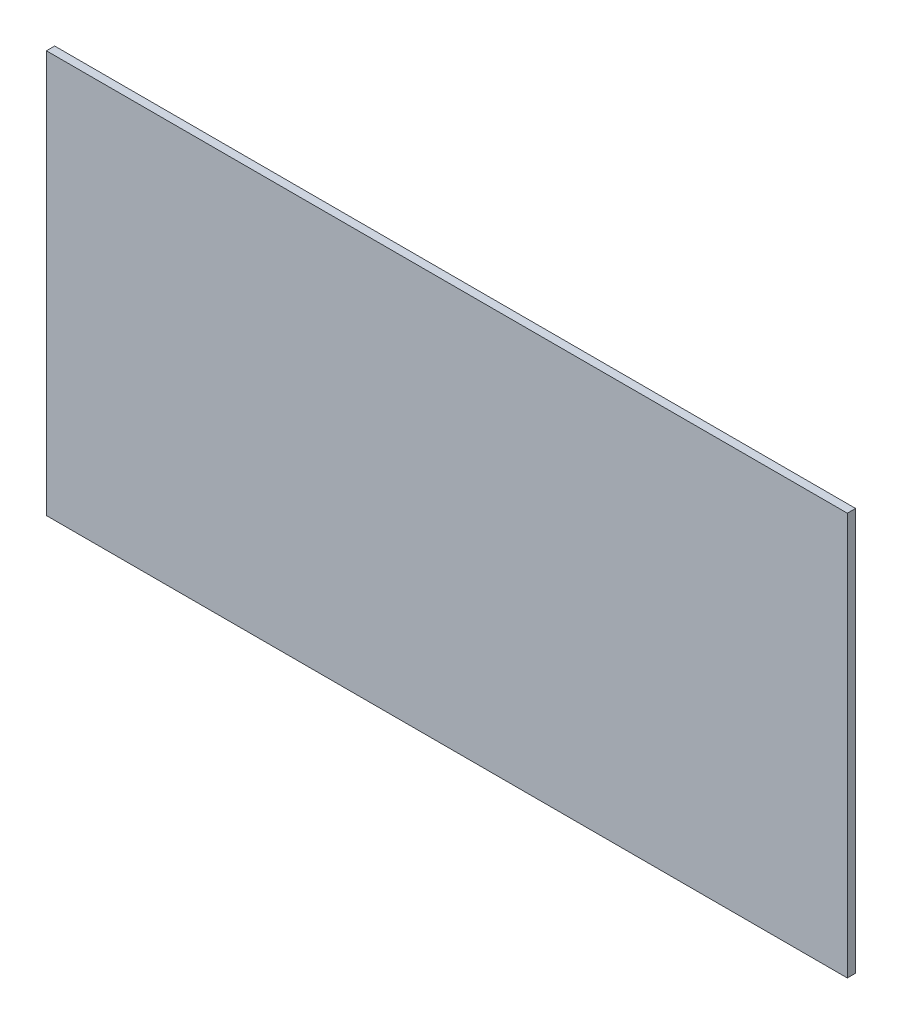
ISO-10303-21;
HEADER;
FILE_DESCRIPTION(('STEP AP214'),'2;1');
FILE_NAME('part.step','',(''),(''),'','','');
FILE_SCHEMA(('AUTOMOTIVE_DESIGN { 1 0 10303 214 1 1 1 1 }'));
ENDSEC;
DATA;
#1=APPLICATION_CONTEXT('core data for automotive mechanical design processes');
#2=APPLICATION_PROTOCOL_DEFINITION('international standard','automotive_design',2000,#1);
#3=PRODUCT_CONTEXT('',#1,'mechanical');
#4=PRODUCT('Part','Part','',(#3));
#5=PRODUCT_RELATED_PRODUCT_CATEGORY('part','',(#4));
#6=PRODUCT_DEFINITION_FORMATION('','',#4);
#7=PRODUCT_DEFINITION_CONTEXT('part definition',#1,'design');
#8=PRODUCT_DEFINITION('design','',#6,#7);
#9=PRODUCT_DEFINITION_SHAPE('','',#8);
#10=(LENGTH_UNIT() NAMED_UNIT(*) SI_UNIT(.MILLI.,.METRE.));
#11=(NAMED_UNIT(*) PLANE_ANGLE_UNIT() SI_UNIT($,.RADIAN.));
#12=(NAMED_UNIT(*) SI_UNIT($,.STERADIAN.) SOLID_ANGLE_UNIT());
#13=UNCERTAINTY_MEASURE_WITH_UNIT(LENGTH_MEASURE(1.E-05),#10,'distance_accuracy_value','');
#14=(GEOMETRIC_REPRESENTATION_CONTEXT(3) GLOBAL_UNCERTAINTY_ASSIGNED_CONTEXT((#13)) GLOBAL_UNIT_ASSIGNED_CONTEXT((#10,
#11,#12)) REPRESENTATION_CONTEXT('',''));
#15=CARTESIAN_POINT('',(0.,0.,0.));
#16=DIRECTION('',(0.,0.,1.));
#17=DIRECTION('',(1.,0.,0.));
#18=AXIS2_PLACEMENT_3D('',#15,#16,#17);
#19=CARTESIAN_POINT('',(-194.,-97.5,4.));
#20=DIRECTION('',(1.,0.,0.));
#21=DIRECTION('',(0.,0.,-1.));
#22=AXIS2_PLACEMENT_3D('',#19,#20,#21);
#23=PLANE('',#22);
#24=DIRECTION('',(0.,-1.,0.));
#25=VECTOR('',#24,1.);
#26=CARTESIAN_POINT('',(-194.,-97.5,0.));
#27=LINE('',#26,#25);
#28=CARTESIAN_POINT('',(-194.,97.5,0.));
#29=VERTEX_POINT('',#28);
#30=CARTESIAN_POINT('',(-194.,-97.5,0.));
#31=VERTEX_POINT('',#30);
#32=EDGE_CURVE('E96',#29,#31,#27,.T.);
#33=ORIENTED_EDGE('',*,*,#32,.T.);
#34=DIRECTION('',(0.,0.,-1.));
#35=VECTOR('',#34,1.);
#36=CARTESIAN_POINT('',(-194.,-97.5,4.));
#37=LINE('',#36,#35);
#38=CARTESIAN_POINT('',(-194.,-97.5,4.));
#39=VERTEX_POINT('',#38);
#40=EDGE_CURVE('E11',#39,#31,#37,.T.);
#41=ORIENTED_EDGE('',*,*,#40,.F.);
#42=DIRECTION('',(0.,-1.,0.));
#43=VECTOR('',#42,1.);
#44=CARTESIAN_POINT('',(-194.,-97.5,4.));
#45=LINE('',#44,#43);
#46=CARTESIAN_POINT('',(-194.,97.5,4.));
#47=VERTEX_POINT('',#46);
#48=EDGE_CURVE('E84',#47,#39,#45,.T.);
#49=ORIENTED_EDGE('',*,*,#48,.F.);
#50=DIRECTION('',(0.,0.,-1.));
#51=VECTOR('',#50,1.);
#52=CARTESIAN_POINT('',(-194.,97.5,4.));
#53=LINE('',#52,#51);
#54=EDGE_CURVE('E92',#47,#29,#53,.T.);
#55=ORIENTED_EDGE('',*,*,#54,.T.);
#56=EDGE_LOOP('',(#33,#41,#49,#55));
#57=FACE_BOUND('',#56,.T.);
#58=ADVANCED_FACE('F33',(#57),#23,.F.);
#59=CARTESIAN_POINT('',(194.,-97.5,4.));
#60=DIRECTION('',(0.,1.,0.));
#61=DIRECTION('',(-1.,0.,0.));
#62=AXIS2_PLACEMENT_3D('',#59,#60,#61);
#63=PLANE('',#62);
#64=DIRECTION('',(1.,0.,0.));
#65=VECTOR('',#64,1.);
#66=CARTESIAN_POINT('',(194.,-97.5,0.));
#67=LINE('',#66,#65);
#68=CARTESIAN_POINT('',(194.,-97.5,0.));
#69=VERTEX_POINT('',#68);
#70=EDGE_CURVE('E88',#31,#69,#67,.T.);
#71=ORIENTED_EDGE('',*,*,#70,.T.);
#72=DIRECTION('',(0.,0.,-1.));
#73=VECTOR('',#72,1.);
#74=CARTESIAN_POINT('',(194.,-97.5,4.));
#75=LINE('',#74,#73);
#76=CARTESIAN_POINT('',(194.,-97.5,4.));
#77=VERTEX_POINT('',#76);
#78=EDGE_CURVE('E41',#77,#69,#75,.T.);
#79=ORIENTED_EDGE('',*,*,#78,.F.);
#80=DIRECTION('',(1.,0.,0.));
#81=VECTOR('',#80,1.);
#82=CARTESIAN_POINT('',(194.,-97.5,4.));
#83=LINE('',#82,#81);
#84=EDGE_CURVE('E79',#39,#77,#83,.T.);
#85=ORIENTED_EDGE('',*,*,#84,.F.);
#86=ORIENTED_EDGE('',*,*,#40,.T.);
#87=EDGE_LOOP('',(#71,#79,#85,#86));
#88=FACE_BOUND('',#87,.T.);
#89=ADVANCED_FACE('F87',(#88),#63,.F.);
#90=CARTESIAN_POINT('',(194.,-97.5,4.));
#91=DIRECTION('',(-1.,0.,0.));
#92=DIRECTION('',(0.,0.,1.));
#93=AXIS2_PLACEMENT_3D('',#90,#91,#92);
#94=PLANE('',#93);
#95=DIRECTION('',(0.,1.,0.));
#96=VECTOR('',#95,1.);
#97=CARTESIAN_POINT('',(194.,-97.5,0.));
#98=LINE('',#97,#96);
#99=CARTESIAN_POINT('',(194.,97.5,0.));
#100=VERTEX_POINT('',#99);
#101=EDGE_CURVE('E66',#69,#100,#98,.T.);
#102=ORIENTED_EDGE('',*,*,#101,.T.);
#103=DIRECTION('',(0.,0.,-1.));
#104=VECTOR('',#103,1.);
#105=CARTESIAN_POINT('',(194.,97.5,4.));
#106=LINE('',#105,#104);
#107=CARTESIAN_POINT('',(194.,97.5,4.));
#108=VERTEX_POINT('',#107);
#109=EDGE_CURVE('E89',#108,#100,#106,.T.);
#110=ORIENTED_EDGE('',*,*,#109,.F.);
#111=DIRECTION('',(0.,1.,0.));
#112=VECTOR('',#111,1.);
#113=CARTESIAN_POINT('',(194.,-97.5,4.));
#114=LINE('',#113,#112);
#115=EDGE_CURVE('E82',#77,#108,#114,.T.);
#116=ORIENTED_EDGE('',*,*,#115,.F.);
#117=ORIENTED_EDGE('',*,*,#78,.T.);
#118=EDGE_LOOP('',(#102,#110,#116,#117));
#119=FACE_BOUND('',#118,.T.);
#120=ADVANCED_FACE('F90',(#119),#94,.F.);
#121=CARTESIAN_POINT('',(194.,97.5,4.));
#122=DIRECTION('',(0.,-1.,0.));
#123=DIRECTION('',(1.,0.,0.));
#124=AXIS2_PLACEMENT_3D('',#121,#122,#123);
#125=PLANE('',#124);
#126=DIRECTION('',(-1.,0.,0.));
#127=VECTOR('',#126,1.);
#128=CARTESIAN_POINT('',(194.,97.5,0.));
#129=LINE('',#128,#127);
#130=EDGE_CURVE('E72',#100,#29,#129,.T.);
#131=ORIENTED_EDGE('',*,*,#130,.T.);
#132=ORIENTED_EDGE('',*,*,#54,.F.);
#133=DIRECTION('',(-1.,0.,0.));
#134=VECTOR('',#133,1.);
#135=CARTESIAN_POINT('',(194.,97.5,4.));
#136=LINE('',#135,#134);
#137=EDGE_CURVE('E49',#108,#47,#136,.T.);
#138=ORIENTED_EDGE('',*,*,#137,.F.);
#139=ORIENTED_EDGE('',*,*,#109,.T.);
#140=EDGE_LOOP('',(#131,#132,#138,#139));
#141=FACE_BOUND('',#140,.T.);
#142=ADVANCED_FACE('F103',(#141),#125,.F.);
#143=CARTESIAN_POINT('',(0.,0.,4.));
#144=DIRECTION('',(0.,0.,1.));
#145=DIRECTION('',(1.,0.,0.));
#146=AXIS2_PLACEMENT_3D('',#143,#144,#145);
#147=PLANE('',#146);
#148=ORIENTED_EDGE('',*,*,#48,.T.);
#149=ORIENTED_EDGE('',*,*,#84,.T.);
#150=ORIENTED_EDGE('',*,*,#115,.T.);
#151=ORIENTED_EDGE('',*,*,#137,.T.);
#152=EDGE_LOOP('',(#148,#149,#150,#151));
#153=FACE_BOUND('',#152,.T.);
#154=ADVANCED_FACE('F80',(#153),#147,.T.);
#155=CARTESIAN_POINT('',(0.,0.,0.));
#156=DIRECTION('',(0.,0.,1.));
#157=DIRECTION('',(1.,0.,0.));
#158=AXIS2_PLACEMENT_3D('',#155,#156,#157);
#159=PLANE('',#158);
#160=ORIENTED_EDGE('',*,*,#32,.F.);
#161=ORIENTED_EDGE('',*,*,#130,.F.);
#162=ORIENTED_EDGE('',*,*,#101,.F.);
#163=ORIENTED_EDGE('',*,*,#70,.F.);
#164=EDGE_LOOP('',(#160,#161,#162,#163));
#165=FACE_BOUND('',#164,.T.);
#166=ADVANCED_FACE('F106',(#165),#159,.F.);
#167=CLOSED_SHELL('',(#58,#89,#120,#142,#154,#166));
#168=MANIFOLD_SOLID_BREP('B2',#167);
#169=ADVANCED_BREP_SHAPE_REPRESENTATION('',(#18,#168),#14);
#170=SHAPE_DEFINITION_REPRESENTATION(#9,#169);
ENDSEC;
END-ISO-10303-21;
